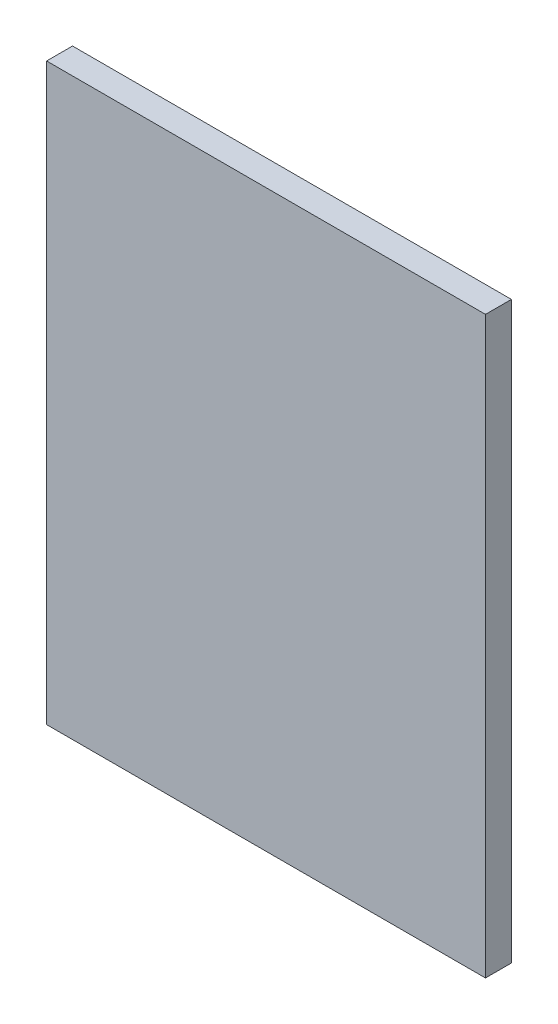
ISO-10303-21;
HEADER;
FILE_DESCRIPTION(('STEP AP214'),'2;1');
FILE_NAME('part.step','',(''),(''),'','','');
FILE_SCHEMA(('AUTOMOTIVE_DESIGN { 1 0 10303 214 1 1 1 1 }'));
ENDSEC;
DATA;
#1=APPLICATION_CONTEXT('core data for automotive mechanical design processes');
#2=APPLICATION_PROTOCOL_DEFINITION('international standard','automotive_design',2000,#1);
#3=PRODUCT_CONTEXT('',#1,'mechanical');
#4=PRODUCT('Part','Part','',(#3));
#5=PRODUCT_RELATED_PRODUCT_CATEGORY('part','',(#4));
#6=PRODUCT_DEFINITION_FORMATION('','',#4);
#7=PRODUCT_DEFINITION_CONTEXT('part definition',#1,'design');
#8=PRODUCT_DEFINITION('design','',#6,#7);
#9=PRODUCT_DEFINITION_SHAPE('','',#8);
#10=(LENGTH_UNIT() NAMED_UNIT(*) SI_UNIT(.MILLI.,.METRE.));
#11=(NAMED_UNIT(*) PLANE_ANGLE_UNIT() SI_UNIT($,.RADIAN.));
#12=(NAMED_UNIT(*) SI_UNIT($,.STERADIAN.) SOLID_ANGLE_UNIT());
#13=UNCERTAINTY_MEASURE_WITH_UNIT(LENGTH_MEASURE(1.E-05),#10,'distance_accuracy_value','');
#14=(GEOMETRIC_REPRESENTATION_CONTEXT(3) GLOBAL_UNCERTAINTY_ASSIGNED_CONTEXT((#13)) GLOBAL_UNIT_ASSIGNED_CONTEXT((#10,
#11,#12)) REPRESENTATION_CONTEXT('',''));
#15=CARTESIAN_POINT('',(0.,0.,0.));
#16=DIRECTION('',(0.,0.,1.));
#17=DIRECTION('',(1.,0.,0.));
#18=AXIS2_PLACEMENT_3D('',#15,#16,#17);
#19=CARTESIAN_POINT('',(0.,0.,24.8));
#20=DIRECTION('',(1.,0.,0.));
#21=DIRECTION('',(0.,0.,-1.));
#22=AXIS2_PLACEMENT_3D('',#19,#20,#21);
#23=PLANE('',#22);
#24=DIRECTION('',(0.,-1.,0.));
#25=VECTOR('',#24,1.);
#26=CARTESIAN_POINT('',(0.,0.,0.));
#27=LINE('',#26,#25);
#28=CARTESIAN_POINT('',(0.,550.,0.));
#29=VERTEX_POINT('',#28);
#30=CARTESIAN_POINT('',(0.,0.,0.));
#31=VERTEX_POINT('',#30);
#32=EDGE_CURVE('E97',#29,#31,#27,.T.);
#33=ORIENTED_EDGE('',*,*,#32,.T.);
#34=DIRECTION('',(0.,0.,-1.));
#35=VECTOR('',#34,1.);
#36=CARTESIAN_POINT('',(0.,0.,24.8));
#37=LINE('',#36,#35);
#38=CARTESIAN_POINT('',(0.,0.,24.8));
#39=VERTEX_POINT('',#38);
#40=EDGE_CURVE('E11',#39,#31,#37,.T.);
#41=ORIENTED_EDGE('',*,*,#40,.F.);
#42=DIRECTION('',(0.,-1.,0.));
#43=VECTOR('',#42,1.);
#44=CARTESIAN_POINT('',(0.,0.,24.8));
#45=LINE('',#44,#43);
#46=CARTESIAN_POINT('',(0.,550.,24.8));
#47=VERTEX_POINT('',#46);
#48=EDGE_CURVE('E85',#47,#39,#45,.T.);
#49=ORIENTED_EDGE('',*,*,#48,.F.);
#50=DIRECTION('',(0.,0.,-1.));
#51=VECTOR('',#50,1.);
#52=CARTESIAN_POINT('',(0.,550.,24.8));
#53=LINE('',#52,#51);
#54=EDGE_CURVE('E93',#47,#29,#53,.T.);
#55=ORIENTED_EDGE('',*,*,#54,.T.);
#56=EDGE_LOOP('',(#33,#41,#49,#55));
#57=FACE_BOUND('',#56,.T.);
#58=ADVANCED_FACE('F34',(#57),#23,.F.);
#59=CARTESIAN_POINT('',(0.,0.,24.8));
#60=DIRECTION('',(0.,1.,0.));
#61=DIRECTION('',(0.,0.,1.));
#62=AXIS2_PLACEMENT_3D('',#59,#60,#61);
#63=PLANE('',#62);
#64=DIRECTION('',(1.,0.,0.));
#65=VECTOR('',#64,1.);
#66=CARTESIAN_POINT('',(0.,0.,0.));
#67=LINE('',#66,#65);
#68=CARTESIAN_POINT('',(420.,0.,0.));
#69=VERTEX_POINT('',#68);
#70=EDGE_CURVE('E89',#31,#69,#67,.T.);
#71=ORIENTED_EDGE('',*,*,#70,.T.);
#72=DIRECTION('',(0.,0.,-1.));
#73=VECTOR('',#72,1.);
#74=CARTESIAN_POINT('',(420.,0.,24.8));
#75=LINE('',#74,#73);
#76=CARTESIAN_POINT('',(420.,0.,24.8));
#77=VERTEX_POINT('',#76);
#78=EDGE_CURVE('E42',#77,#69,#75,.T.);
#79=ORIENTED_EDGE('',*,*,#78,.F.);
#80=DIRECTION('',(1.,0.,0.));
#81=VECTOR('',#80,1.);
#82=CARTESIAN_POINT('',(0.,0.,24.8));
#83=LINE('',#82,#81);
#84=EDGE_CURVE('E80',#39,#77,#83,.T.);
#85=ORIENTED_EDGE('',*,*,#84,.F.);
#86=ORIENTED_EDGE('',*,*,#40,.T.);
#87=EDGE_LOOP('',(#71,#79,#85,#86));
#88=FACE_BOUND('',#87,.T.);
#89=ADVANCED_FACE('F88',(#88),#63,.F.);
#90=CARTESIAN_POINT('',(420.,0.,24.8));
#91=DIRECTION('',(-1.,0.,0.));
#92=DIRECTION('',(0.,0.,1.));
#93=AXIS2_PLACEMENT_3D('',#90,#91,#92);
#94=PLANE('',#93);
#95=DIRECTION('',(0.,1.,0.));
#96=VECTOR('',#95,1.);
#97=CARTESIAN_POINT('',(420.,0.,0.));
#98=LINE('',#97,#96);
#99=CARTESIAN_POINT('',(420.,550.,0.));
#100=VERTEX_POINT('',#99);
#101=EDGE_CURVE('E67',#69,#100,#98,.T.);
#102=ORIENTED_EDGE('',*,*,#101,.T.);
#103=DIRECTION('',(0.,0.,-1.));
#104=VECTOR('',#103,1.);
#105=CARTESIAN_POINT('',(420.,550.,24.8));
#106=LINE('',#105,#104);
#107=CARTESIAN_POINT('',(420.,550.,24.8));
#108=VERTEX_POINT('',#107);
#109=EDGE_CURVE('E90',#108,#100,#106,.T.);
#110=ORIENTED_EDGE('',*,*,#109,.F.);
#111=DIRECTION('',(0.,1.,0.));
#112=VECTOR('',#111,1.);
#113=CARTESIAN_POINT('',(420.,0.,24.8));
#114=LINE('',#113,#112);
#115=EDGE_CURVE('E83',#77,#108,#114,.T.);
#116=ORIENTED_EDGE('',*,*,#115,.F.);
#117=ORIENTED_EDGE('',*,*,#78,.T.);
#118=EDGE_LOOP('',(#102,#110,#116,#117));
#119=FACE_BOUND('',#118,.T.);
#120=ADVANCED_FACE('F91',(#119),#94,.F.);
#121=CARTESIAN_POINT('',(0.,550.,24.8));
#122=DIRECTION('',(0.,-1.,0.));
#123=DIRECTION('',(0.,0.,-1.));
#124=AXIS2_PLACEMENT_3D('',#121,#122,#123);
#125=PLANE('',#124);
#126=DIRECTION('',(-1.,0.,0.));
#127=VECTOR('',#126,1.);
#128=CARTESIAN_POINT('',(0.,550.,0.));
#129=LINE('',#128,#127);
#130=EDGE_CURVE('E73',#100,#29,#129,.T.);
#131=ORIENTED_EDGE('',*,*,#130,.T.);
#132=ORIENTED_EDGE('',*,*,#54,.F.);
#133=DIRECTION('',(-1.,0.,0.));
#134=VECTOR('',#133,1.);
#135=CARTESIAN_POINT('',(0.,550.,24.8));
#136=LINE('',#135,#134);
#137=EDGE_CURVE('E50',#108,#47,#136,.T.);
#138=ORIENTED_EDGE('',*,*,#137,.F.);
#139=ORIENTED_EDGE('',*,*,#109,.T.);
#140=EDGE_LOOP('',(#131,#132,#138,#139));
#141=FACE_BOUND('',#140,.T.);
#142=ADVANCED_FACE('F104',(#141),#125,.F.);
#143=CARTESIAN_POINT('',(0.,0.,24.8));
#144=DIRECTION('',(0.,0.,-1.));
#145=DIRECTION('',(-1.,0.,0.));
#146=AXIS2_PLACEMENT_3D('',#143,#144,#145);
#147=PLANE('',#146);
#148=ORIENTED_EDGE('',*,*,#48,.T.);
#149=ORIENTED_EDGE('',*,*,#84,.T.);
#150=ORIENTED_EDGE('',*,*,#115,.T.);
#151=ORIENTED_EDGE('',*,*,#137,.T.);
#152=EDGE_LOOP('',(#148,#149,#150,#151));
#153=FACE_BOUND('',#152,.T.);
#154=ADVANCED_FACE('F81',(#153),#147,.F.);
#155=CARTESIAN_POINT('',(0.,0.,0.));
#156=DIRECTION('',(0.,0.,-1.));
#157=DIRECTION('',(-1.,0.,0.));
#158=AXIS2_PLACEMENT_3D('',#155,#156,#157);
#159=PLANE('',#158);
#160=ORIENTED_EDGE('',*,*,#32,.F.);
#161=ORIENTED_EDGE('',*,*,#130,.F.);
#162=ORIENTED_EDGE('',*,*,#101,.F.);
#163=ORIENTED_EDGE('',*,*,#70,.F.);
#164=EDGE_LOOP('',(#160,#161,#162,#163));
#165=FACE_BOUND('',#164,.T.);
#166=ADVANCED_FACE('F107',(#165),#159,.T.);
#167=CLOSED_SHELL('',(#58,#89,#120,#142,#154,#166));
#168=MANIFOLD_SOLID_BREP('B2',#167);
#169=ADVANCED_BREP_SHAPE_REPRESENTATION('',(#18,#168),#14);
#170=SHAPE_DEFINITION_REPRESENTATION(#9,#169);
ENDSEC;
END-ISO-10303-21;
